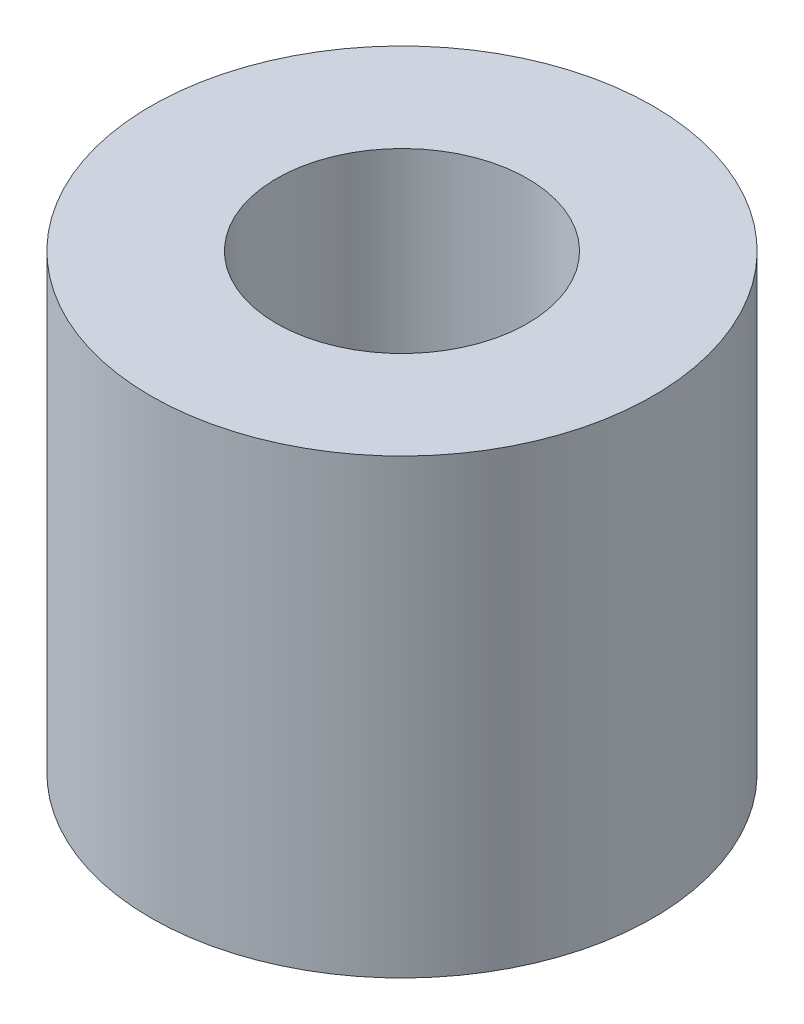
ISO-10303-21;
HEADER;
FILE_DESCRIPTION(('STEP AP214'),'2;1');
FILE_NAME('part.step','',(''),(''),'','','');
FILE_SCHEMA(('AUTOMOTIVE_DESIGN { 1 0 10303 214 1 1 1 1 }'));
ENDSEC;
DATA;
#1=APPLICATION_CONTEXT('core data for automotive mechanical design processes');
#2=APPLICATION_PROTOCOL_DEFINITION('international standard','automotive_design',2000,#1);
#3=PRODUCT_CONTEXT('',#1,'mechanical');
#4=PRODUCT('Part','Part','',(#3));
#5=PRODUCT_RELATED_PRODUCT_CATEGORY('part','',(#4));
#6=PRODUCT_DEFINITION_FORMATION('','',#4);
#7=PRODUCT_DEFINITION_CONTEXT('part definition',#1,'design');
#8=PRODUCT_DEFINITION('design','',#6,#7);
#9=PRODUCT_DEFINITION_SHAPE('','',#8);
#10=(LENGTH_UNIT() NAMED_UNIT(*) SI_UNIT(.MILLI.,.METRE.));
#11=(NAMED_UNIT(*) PLANE_ANGLE_UNIT() SI_UNIT($,.RADIAN.));
#12=(NAMED_UNIT(*) SI_UNIT($,.STERADIAN.) SOLID_ANGLE_UNIT());
#13=UNCERTAINTY_MEASURE_WITH_UNIT(LENGTH_MEASURE(1.E-05),#10,'distance_accuracy_value','');
#14=(GEOMETRIC_REPRESENTATION_CONTEXT(3) GLOBAL_UNCERTAINTY_ASSIGNED_CONTEXT((#13)) GLOBAL_UNIT_ASSIGNED_CONTEXT((#10,
#11,#12)) REPRESENTATION_CONTEXT('',''));
#15=CARTESIAN_POINT('',(0.,0.,0.));
#16=DIRECTION('',(0.,0.,1.));
#17=DIRECTION('',(1.,0.,0.));
#18=AXIS2_PLACEMENT_3D('',#15,#16,#17);
#19=CARTESIAN_POINT('',(0.,9.,0.));
#20=DIRECTION('',(0.,1.,0.));
#21=DIRECTION('',(0.,0.,1.));
#22=AXIS2_PLACEMENT_3D('',#19,#20,#21);
#23=PLANE('',#22);
#24=CARTESIAN_POINT('',(0.,9.,0.));
#25=DIRECTION('',(0.,1.,0.));
#26=DIRECTION('',(0.,0.,1.));
#27=AXIS2_PLACEMENT_3D('',#24,#25,#26);
#28=CIRCLE('',#27,5.);
#29=CARTESIAN_POINT('',(0.,9.,5.));
#30=VERTEX_POINT('',#29);
#31=EDGE_CURVE('E10',#30,#30,#28,.T.);
#32=ORIENTED_EDGE('',*,*,#31,.T.);
#33=EDGE_LOOP('',(#32));
#34=FACE_BOUND('',#33,.T.);
#35=CARTESIAN_POINT('',(0.,9.,0.));
#36=DIRECTION('',(0.,1.,0.));
#37=DIRECTION('',(0.,0.,1.));
#38=AXIS2_PLACEMENT_3D('',#35,#36,#37);
#39=CIRCLE('',#38,2.5);
#40=CARTESIAN_POINT('',(0.,9.,2.5));
#41=VERTEX_POINT('',#40);
#42=EDGE_CURVE('E42',#41,#41,#39,.T.);
#43=ORIENTED_EDGE('',*,*,#42,.F.);
#44=EDGE_LOOP('',(#43));
#45=FACE_BOUND('',#44,.T.);
#46=ADVANCED_FACE('F31',(#34,#45),#23,.T.);
#47=CARTESIAN_POINT('',(0.,0.,0.));
#48=DIRECTION('',(0.,1.,0.));
#49=DIRECTION('',(0.,0.,1.));
#50=AXIS2_PLACEMENT_3D('',#47,#48,#49);
#51=PLANE('',#50);
#52=CARTESIAN_POINT('',(0.,0.,0.));
#53=DIRECTION('',(0.,1.,0.));
#54=DIRECTION('',(0.,0.,1.));
#55=AXIS2_PLACEMENT_3D('',#52,#53,#54);
#56=CIRCLE('',#55,5.);
#57=CARTESIAN_POINT('',(0.,0.,5.));
#58=VERTEX_POINT('',#57);
#59=EDGE_CURVE('E35',#58,#58,#56,.T.);
#60=ORIENTED_EDGE('',*,*,#59,.F.);
#61=EDGE_LOOP('',(#60));
#62=FACE_BOUND('',#61,.T.);
#63=CARTESIAN_POINT('',(0.,0.,0.));
#64=DIRECTION('',(0.,1.,0.));
#65=DIRECTION('',(0.,0.,1.));
#66=AXIS2_PLACEMENT_3D('',#63,#64,#65);
#67=CIRCLE('',#66,2.5);
#68=CARTESIAN_POINT('',(0.,0.,2.5));
#69=VERTEX_POINT('',#68);
#70=EDGE_CURVE('E44',#69,#69,#67,.T.);
#71=ORIENTED_EDGE('',*,*,#70,.T.);
#72=EDGE_LOOP('',(#71));
#73=FACE_BOUND('',#72,.T.);
#74=ADVANCED_FACE('F54',(#62,#73),#51,.F.);
#75=CARTESIAN_POINT('',(0.,9.,0.));
#76=DIRECTION('',(0.,-1.,0.));
#77=DIRECTION('',(0.,0.,-1.));
#78=AXIS2_PLACEMENT_3D('',#75,#76,#77);
#79=CYLINDRICAL_SURFACE('',#78,5.);
#80=ORIENTED_EDGE('',*,*,#31,.F.);
#81=EDGE_LOOP('',(#80));
#82=FACE_BOUND('',#81,.T.);
#83=ORIENTED_EDGE('',*,*,#59,.T.);
#84=EDGE_LOOP('',(#83));
#85=FACE_BOUND('',#84,.T.);
#86=ADVANCED_FACE('F33',(#82,#85),#79,.T.);
#87=CARTESIAN_POINT('',(0.,9.,0.));
#88=DIRECTION('',(0.,-1.,0.));
#89=DIRECTION('',(0.,0.,-1.));
#90=AXIS2_PLACEMENT_3D('',#87,#88,#89);
#91=CYLINDRICAL_SURFACE('',#90,2.5);
#92=ORIENTED_EDGE('',*,*,#42,.T.);
#93=EDGE_LOOP('',(#92));
#94=FACE_BOUND('',#93,.T.);
#95=ORIENTED_EDGE('',*,*,#70,.F.);
#96=EDGE_LOOP('',(#95));
#97=FACE_BOUND('',#96,.T.);
#98=ADVANCED_FACE('F50',(#94,#97),#91,.F.);
#99=CLOSED_SHELL('',(#46,#74,#86,#98));
#100=MANIFOLD_SOLID_BREP('B2',#99);
#101=ADVANCED_BREP_SHAPE_REPRESENTATION('',(#18,#100),#14);
#102=SHAPE_DEFINITION_REPRESENTATION(#9,#101);
ENDSEC;
END-ISO-10303-21;
